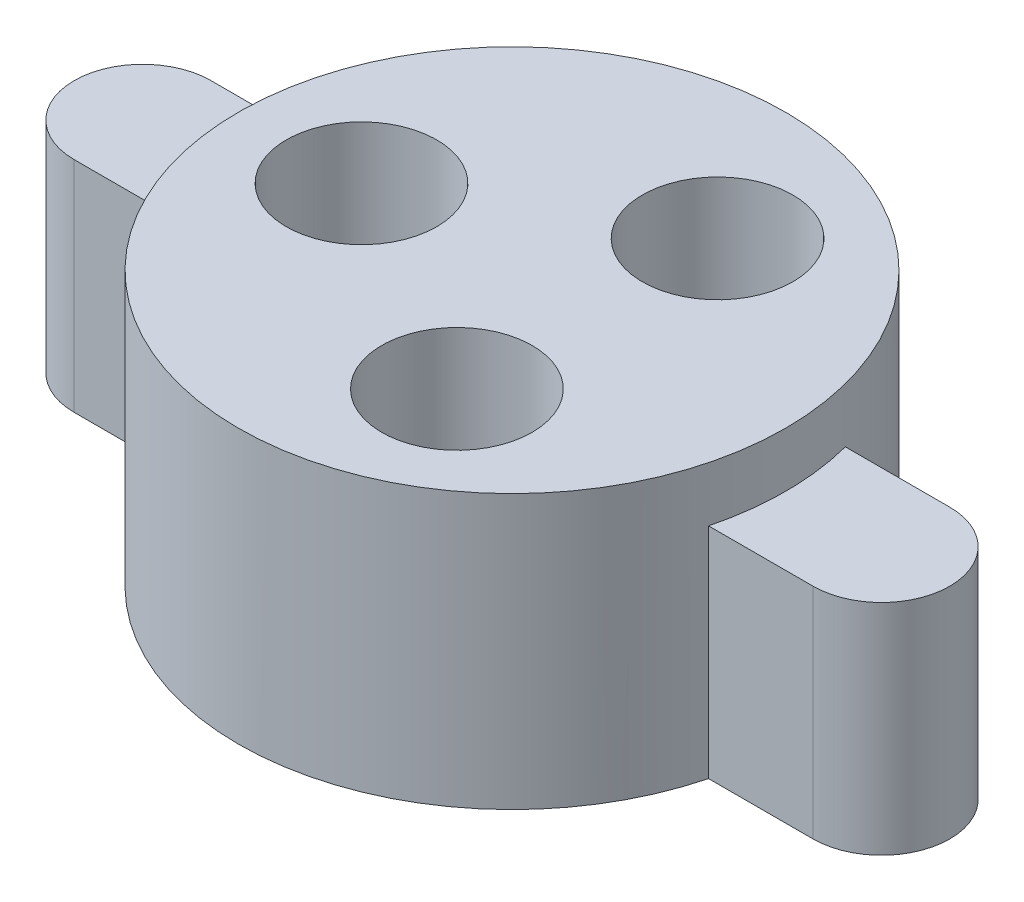
ISO-10303-21;
HEADER;
FILE_DESCRIPTION(('STEP AP214'),'2;1');
FILE_NAME('part.step','',(''),(''),'','','');
FILE_SCHEMA(('AUTOMOTIVE_DESIGN { 1 0 10303 214 1 1 1 1 }'));
ENDSEC;
DATA;
#1=APPLICATION_CONTEXT('core data for automotive mechanical design processes');
#2=APPLICATION_PROTOCOL_DEFINITION('international standard','automotive_design',2000,#1);
#3=PRODUCT_CONTEXT('',#1,'mechanical');
#4=PRODUCT('Part','Part','',(#3));
#5=PRODUCT_RELATED_PRODUCT_CATEGORY('part','',(#4));
#6=PRODUCT_DEFINITION_FORMATION('','',#4);
#7=PRODUCT_DEFINITION_CONTEXT('part definition',#1,'design');
#8=PRODUCT_DEFINITION('design','',#6,#7);
#9=PRODUCT_DEFINITION_SHAPE('','',#8);
#10=(LENGTH_UNIT() NAMED_UNIT(*) SI_UNIT(.MILLI.,.METRE.));
#11=(NAMED_UNIT(*) PLANE_ANGLE_UNIT() SI_UNIT($,.RADIAN.));
#12=(NAMED_UNIT(*) SI_UNIT($,.STERADIAN.) SOLID_ANGLE_UNIT());
#13=UNCERTAINTY_MEASURE_WITH_UNIT(LENGTH_MEASURE(1.E-05),#10,'distance_accuracy_value','');
#14=(GEOMETRIC_REPRESENTATION_CONTEXT(3) GLOBAL_UNCERTAINTY_ASSIGNED_CONTEXT((#13)) GLOBAL_UNIT_ASSIGNED_CONTEXT((#10,
#11,#12)) REPRESENTATION_CONTEXT('',''));
#15=CARTESIAN_POINT('',(0.,0.,0.));
#16=DIRECTION('',(0.,0.,1.));
#17=DIRECTION('',(1.,0.,0.));
#18=AXIS2_PLACEMENT_3D('',#15,#16,#17);
#19=CARTESIAN_POINT('',(-10.6542412771445,-55.6623242460077,207.513783632024));
#20=DIRECTION('',(0.,-1.,0.));
#21=DIRECTION('',(0.,0.,-1.));
#22=AXIS2_PLACEMENT_3D('',#19,#20,#21);
#23=PLANE('',#22);
#24=DIRECTION('',(1.,0.,0.));
#25=VECTOR('',#24,1.);
#26=CARTESIAN_POINT('',(-5.54721896024303,-55.6623242460077,217.513783632024));
#27=LINE('',#26,#25);
#28=CARTESIAN_POINT('',(-7.61476059472449,-55.6623242460077,217.513783632024));
#29=VERTEX_POINT('',#28);
#30=CARTESIAN_POINT('',(-3.79721896024304,-55.6623242460077,217.513783632024));
#31=VERTEX_POINT('',#30);
#32=EDGE_CURVE('E224',#29,#31,#27,.T.);
#33=ORIENTED_EDGE('',*,*,#32,.T.);
#34=CARTESIAN_POINT('',(-3.79721896024304,-55.6623242460077,215.013783632024));
#35=DIRECTION('',(0.,1.,0.));
#36=DIRECTION('',(1.,0.,0.));
#37=AXIS2_PLACEMENT_3D('',#34,#35,#36);
#38=CIRCLE('',#37,2.5);
#39=CARTESIAN_POINT('',(-3.79721896024304,-55.6623242460077,212.513783632024));
#40=VERTEX_POINT('',#39);
#41=EDGE_CURVE('E11',#31,#40,#38,.T.);
#42=ORIENTED_EDGE('',*,*,#41,.T.);
#43=DIRECTION('',(1.,0.,0.));
#44=VECTOR('',#43,1.);
#45=CARTESIAN_POINT('',(-5.54721896024303,-55.6623242460077,212.513783632024));
#46=LINE('',#45,#44);
#47=CARTESIAN_POINT('',(-7.61476059472449,-55.6623242460077,212.513783632024));
#48=VERTEX_POINT('',#47);
#49=EDGE_CURVE('E226',#48,#40,#46,.T.);
#50=ORIENTED_EDGE('',*,*,#49,.F.);
#51=CARTESIAN_POINT('',(-17.297218960243,-55.6623242460077,215.013783632024));
#52=DIRECTION('',(0.,-1.,0.));
#53=DIRECTION('',(1.,0.,0.));
#54=AXIS2_PLACEMENT_3D('',#51,#52,#53);
#55=CIRCLE('',#54,10.);
#56=EDGE_CURVE('E139',#48,#29,#55,.T.);
#57=ORIENTED_EDGE('',*,*,#56,.T.);
#58=EDGE_LOOP('',(#33,#42,#50,#57));
#59=FACE_BOUND('',#58,.T.);
#60=ADVANCED_FACE('F17',(#59),#23,.F.);
#61=CARTESIAN_POINT('',(-3.79721896024304,-55.6623242460077,215.013783632024));
#62=DIRECTION('',(0.,-1.,0.));
#63=DIRECTION('',(1.,0.,0.));
#64=AXIS2_PLACEMENT_3D('',#61,#62,#63);
#65=CYLINDRICAL_SURFACE('',#64,2.5);
#66=CARTESIAN_POINT('',(-3.79721896024304,-63.6623242460077,215.013783632024));
#67=DIRECTION('',(0.,1.,0.));
#68=DIRECTION('',(1.,0.,0.));
#69=AXIS2_PLACEMENT_3D('',#66,#67,#68);
#70=CIRCLE('',#69,2.5);
#71=CARTESIAN_POINT('',(-3.79721896024304,-63.6623242460077,217.513783632024));
#72=VERTEX_POINT('',#71);
#73=CARTESIAN_POINT('',(-3.79721896024304,-63.6623242460077,212.513783632024));
#74=VERTEX_POINT('',#73);
#75=EDGE_CURVE('E190',#72,#74,#70,.T.);
#76=ORIENTED_EDGE('',*,*,#75,.T.);
#77=DIRECTION('',(0.,-1.,0.));
#78=VECTOR('',#77,1.);
#79=CARTESIAN_POINT('',(-3.79721896024304,-55.6623242460077,212.513783632024));
#80=LINE('',#79,#78);
#81=EDGE_CURVE('E27',#40,#74,#80,.T.);
#82=ORIENTED_EDGE('',*,*,#81,.F.);
#83=ORIENTED_EDGE('',*,*,#41,.F.);
#84=DIRECTION('',(0.,-1.,0.));
#85=VECTOR('',#84,1.);
#86=CARTESIAN_POINT('',(-3.79721896024304,-55.6623242460077,217.513783632024));
#87=LINE('',#86,#85);
#88=EDGE_CURVE('E219',#31,#72,#87,.T.);
#89=ORIENTED_EDGE('',*,*,#88,.T.);
#90=EDGE_LOOP('',(#76,#82,#83,#89));
#91=FACE_BOUND('',#90,.T.);
#92=ADVANCED_FACE('F19',(#91),#65,.T.);
#93=CARTESIAN_POINT('',(-5.54721896024303,-55.6623242460077,212.513783632024));
#94=DIRECTION('',(0.,0.,-1.));
#95=DIRECTION('',(0.,-1.,0.));
#96=AXIS2_PLACEMENT_3D('',#93,#94,#95);
#97=PLANE('',#96);
#98=DIRECTION('',(1.,0.,0.));
#99=VECTOR('',#98,1.);
#100=CARTESIAN_POINT('',(-5.54721896024303,-63.6623242460077,212.513783632024));
#101=LINE('',#100,#99);
#102=CARTESIAN_POINT('',(-7.61476059472449,-63.6623242460077,212.513783632024));
#103=VERTEX_POINT('',#102);
#104=EDGE_CURVE('E183',#103,#74,#101,.T.);
#105=ORIENTED_EDGE('',*,*,#104,.F.);
#106=DIRECTION('',(0.,-1.,0.));
#107=VECTOR('',#106,1.);
#108=CARTESIAN_POINT('',(-7.61476059472449,-55.6623242460077,212.513783632024));
#109=LINE('',#108,#107);
#110=EDGE_CURVE('E141',#48,#103,#109,.T.);
#111=ORIENTED_EDGE('',*,*,#110,.F.);
#112=ORIENTED_EDGE('',*,*,#49,.T.);
#113=ORIENTED_EDGE('',*,*,#81,.T.);
#114=EDGE_LOOP('',(#105,#111,#112,#113));
#115=FACE_BOUND('',#114,.T.);
#116=ADVANCED_FACE('F234',(#115),#97,.T.);
#117=CARTESIAN_POINT('',(-5.54721896024303,-55.6623242460077,217.513783632024));
#118=DIRECTION('',(0.,0.,-1.));
#119=DIRECTION('',(0.,-1.,0.));
#120=AXIS2_PLACEMENT_3D('',#117,#118,#119);
#121=PLANE('',#120);
#122=DIRECTION('',(1.,0.,0.));
#123=VECTOR('',#122,1.);
#124=CARTESIAN_POINT('',(-5.54721896024303,-63.6623242460077,217.513783632024));
#125=LINE('',#124,#123);
#126=CARTESIAN_POINT('',(-7.61476059472449,-63.6623242460077,217.513783632024));
#127=VERTEX_POINT('',#126);
#128=EDGE_CURVE('E192',#127,#72,#125,.T.);
#129=ORIENTED_EDGE('',*,*,#128,.T.);
#130=ORIENTED_EDGE('',*,*,#88,.F.);
#131=ORIENTED_EDGE('',*,*,#32,.F.);
#132=DIRECTION('',(0.,-1.,0.));
#133=VECTOR('',#132,1.);
#134=CARTESIAN_POINT('',(-7.61476059472449,-55.6623242460077,217.513783632024));
#135=LINE('',#134,#133);
#136=EDGE_CURVE('E131',#29,#127,#135,.T.);
#137=ORIENTED_EDGE('',*,*,#136,.T.);
#138=EDGE_LOOP('',(#129,#130,#131,#137));
#139=FACE_BOUND('',#138,.T.);
#140=ADVANCED_FACE('F397',(#139),#121,.F.);
#141=CARTESIAN_POINT('',(-10.6542412771445,-55.6623242460077,207.513783632024));
#142=DIRECTION('',(0.,-1.,0.));
#143=DIRECTION('',(0.,0.,-1.));
#144=AXIS2_PLACEMENT_3D('',#141,#142,#143);
#145=PLANE('',#144);
#146=DIRECTION('',(1.,0.,0.));
#147=VECTOR('',#146,1.);
#148=CARTESIAN_POINT('',(-29.0472189602431,-55.6623242460077,212.513783632024));
#149=LINE('',#148,#147);
#150=CARTESIAN_POINT('',(-30.797218960243,-55.6623242460077,212.513783632024));
#151=VERTEX_POINT('',#150);
#152=CARTESIAN_POINT('',(-26.9796773257616,-55.6623242460077,212.513783632024));
#153=VERTEX_POINT('',#152);
#154=EDGE_CURVE('E208',#151,#153,#149,.T.);
#155=ORIENTED_EDGE('',*,*,#154,.F.);
#156=CARTESIAN_POINT('',(-30.797218960243,-55.6623242460077,215.013783632024));
#157=DIRECTION('',(0.,-1.,0.));
#158=DIRECTION('',(1.,0.,0.));
#159=AXIS2_PLACEMENT_3D('',#156,#157,#158);
#160=CIRCLE('',#159,2.5);
#161=CARTESIAN_POINT('',(-30.797218960243,-55.6623242460077,217.513783632024));
#162=VERTEX_POINT('',#161);
#163=EDGE_CURVE('E220',#162,#151,#160,.T.);
#164=ORIENTED_EDGE('',*,*,#163,.F.);
#165=DIRECTION('',(1.,0.,0.));
#166=VECTOR('',#165,1.);
#167=CARTESIAN_POINT('',(-28.8884481430023,-55.6623242460077,217.513783632024));
#168=LINE('',#167,#166);
#169=CARTESIAN_POINT('',(-26.9796773257616,-55.6623242460077,217.513783632024));
#170=VERTEX_POINT('',#169);
#171=EDGE_CURVE('E211',#162,#170,#168,.T.);
#172=ORIENTED_EDGE('',*,*,#171,.T.);
#173=CARTESIAN_POINT('',(-17.297218960243,-55.6623242460077,215.013783632024));
#174=DIRECTION('',(0.,-1.,0.));
#175=DIRECTION('',(1.,0.,0.));
#176=AXIS2_PLACEMENT_3D('',#173,#174,#175);
#177=CIRCLE('',#176,10.);
#178=EDGE_CURVE('E159',#170,#153,#177,.T.);
#179=ORIENTED_EDGE('',*,*,#178,.T.);
#180=EDGE_LOOP('',(#155,#164,#172,#179));
#181=FACE_BOUND('',#180,.T.);
#182=ADVANCED_FACE('F425',(#181),#145,.F.);
#183=CARTESIAN_POINT('',(-30.797218960243,-55.6623242460077,215.013783632024));
#184=DIRECTION('',(0.,-1.,0.));
#185=DIRECTION('',(1.,0.,0.));
#186=AXIS2_PLACEMENT_3D('',#183,#184,#185);
#187=CYLINDRICAL_SURFACE('',#186,2.5);
#188=CARTESIAN_POINT('',(-30.797218960243,-63.6623242460077,215.013783632024));
#189=DIRECTION('',(0.,-1.,0.));
#190=DIRECTION('',(1.,0.,0.));
#191=AXIS2_PLACEMENT_3D('',#188,#189,#190);
#192=CIRCLE('',#191,2.5);
#193=CARTESIAN_POINT('',(-30.797218960243,-63.6623242460077,217.513783632024));
#194=VERTEX_POINT('',#193);
#195=CARTESIAN_POINT('',(-30.797218960243,-63.6623242460077,212.513783632024));
#196=VERTEX_POINT('',#195);
#197=EDGE_CURVE('E196',#194,#196,#192,.T.);
#198=ORIENTED_EDGE('',*,*,#197,.F.);
#199=DIRECTION('',(0.,-1.,0.));
#200=VECTOR('',#199,1.);
#201=CARTESIAN_POINT('',(-30.797218960243,-55.6623242460077,217.513783632024));
#202=LINE('',#201,#200);
#203=EDGE_CURVE('E212',#162,#194,#202,.T.);
#204=ORIENTED_EDGE('',*,*,#203,.F.);
#205=ORIENTED_EDGE('',*,*,#163,.T.);
#206=DIRECTION('',(0.,-1.,0.));
#207=VECTOR('',#206,1.);
#208=CARTESIAN_POINT('',(-30.797218960243,-55.6623242460077,212.513783632024));
#209=LINE('',#208,#207);
#210=EDGE_CURVE('E202',#151,#196,#209,.T.);
#211=ORIENTED_EDGE('',*,*,#210,.T.);
#212=EDGE_LOOP('',(#198,#204,#205,#211));
#213=FACE_BOUND('',#212,.T.);
#214=ADVANCED_FACE('F430',(#213),#187,.T.);
#215=CARTESIAN_POINT('',(-28.8884481430023,-55.6623242460077,217.513783632024));
#216=DIRECTION('',(0.,0.,-1.));
#217=DIRECTION('',(0.,-1.,0.));
#218=AXIS2_PLACEMENT_3D('',#215,#216,#217);
#219=PLANE('',#218);
#220=DIRECTION('',(1.,0.,0.));
#221=VECTOR('',#220,1.);
#222=CARTESIAN_POINT('',(-28.8884481430023,-63.6623242460077,217.513783632024));
#223=LINE('',#222,#221);
#224=CARTESIAN_POINT('',(-26.9796773257616,-63.6623242460077,217.513783632024));
#225=VERTEX_POINT('',#224);
#226=EDGE_CURVE('E193',#194,#225,#223,.T.);
#227=ORIENTED_EDGE('',*,*,#226,.T.);
#228=DIRECTION('',(0.,-1.,0.));
#229=VECTOR('',#228,1.);
#230=CARTESIAN_POINT('',(-26.9796773257616,-55.6623242460077,217.513783632024));
#231=LINE('',#230,#229);
#232=EDGE_CURVE('E170',#170,#225,#231,.T.);
#233=ORIENTED_EDGE('',*,*,#232,.F.);
#234=ORIENTED_EDGE('',*,*,#171,.F.);
#235=ORIENTED_EDGE('',*,*,#203,.T.);
#236=EDGE_LOOP('',(#227,#233,#234,#235));
#237=FACE_BOUND('',#236,.T.);
#238=ADVANCED_FACE('F363',(#237),#219,.F.);
#239=CARTESIAN_POINT('',(-29.0472189602431,-55.6623242460077,212.513783632024));
#240=DIRECTION('',(0.,0.,-1.));
#241=DIRECTION('',(0.,-1.,0.));
#242=AXIS2_PLACEMENT_3D('',#239,#240,#241);
#243=PLANE('',#242);
#244=DIRECTION('',(1.,0.,0.));
#245=VECTOR('',#244,1.);
#246=CARTESIAN_POINT('',(-29.0472189602431,-63.6623242460077,212.513783632024));
#247=LINE('',#246,#245);
#248=CARTESIAN_POINT('',(-26.9796773257616,-63.6623242460077,212.513783632024));
#249=VERTEX_POINT('',#248);
#250=EDGE_CURVE('E205',#196,#249,#247,.T.);
#251=ORIENTED_EDGE('',*,*,#250,.F.);
#252=ORIENTED_EDGE('',*,*,#210,.F.);
#253=ORIENTED_EDGE('',*,*,#154,.T.);
#254=DIRECTION('',(0.,-1.,0.));
#255=VECTOR('',#254,1.);
#256=CARTESIAN_POINT('',(-26.9796773257616,-55.6623242460077,212.513783632024));
#257=LINE('',#256,#255);
#258=EDGE_CURVE('E156',#153,#249,#257,.T.);
#259=ORIENTED_EDGE('',*,*,#258,.T.);
#260=EDGE_LOOP('',(#251,#252,#253,#259));
#261=FACE_BOUND('',#260,.T.);
#262=ADVANCED_FACE('F354',(#261),#243,.T.);
#263=CARTESIAN_POINT('',(-17.297218960243,-53.6623242460077,215.013783632024));
#264=DIRECTION('',(0.,-1.,0.));
#265=DIRECTION('',(0.,0.,-1.));
#266=AXIS2_PLACEMENT_3D('',#263,#264,#265);
#267=PLANE('',#266);
#268=CARTESIAN_POINT('',(-17.297218960243,-53.6623242460077,215.013783632024));
#269=DIRECTION('',(0.,-1.,0.));
#270=DIRECTION('',(1.,0.,0.));
#271=AXIS2_PLACEMENT_3D('',#268,#269,#270);
#272=CIRCLE('',#271,10.);
#273=CARTESIAN_POINT('',(-7.29721896024305,-53.6623242460077,215.013783632024));
#274=VERTEX_POINT('',#273);
#275=EDGE_CURVE('E126',#274,#274,#272,.T.);
#276=ORIENTED_EDGE('',*,*,#275,.F.);
#277=EDGE_LOOP('',(#276));
#278=FACE_BOUND('',#277,.T.);
#279=CARTESIAN_POINT('',(-22.797218960243,-53.6623242460077,215.013783632024));
#280=DIRECTION('',(0.,-1.,0.));
#281=DIRECTION('',(1.,0.,0.));
#282=AXIS2_PLACEMENT_3D('',#279,#280,#281);
#283=CIRCLE('',#282,2.75);
#284=CARTESIAN_POINT('',(-20.0472189602431,-53.6623242460077,215.013783632024));
#285=VERTEX_POINT('',#284);
#286=EDGE_CURVE('E172',#285,#285,#283,.T.);
#287=ORIENTED_EDGE('',*,*,#286,.T.);
#288=EDGE_LOOP('',(#287));
#289=FACE_BOUND('',#288,.T.);
#290=CARTESIAN_POINT('',(-14.547218960243,-53.6623242460077,210.25064391121));
#291=DIRECTION('',(0.,-1.,0.));
#292=DIRECTION('',(1.,0.,0.));
#293=AXIS2_PLACEMENT_3D('',#290,#291,#292);
#294=CIRCLE('',#293,2.75);
#295=CARTESIAN_POINT('',(-11.797218960243,-53.6623242460077,210.25064391121));
#296=VERTEX_POINT('',#295);
#297=EDGE_CURVE('E155',#296,#296,#294,.T.);
#298=ORIENTED_EDGE('',*,*,#297,.T.);
#299=EDGE_LOOP('',(#298));
#300=FACE_BOUND('',#299,.T.);
#301=CARTESIAN_POINT('',(-14.547218960243,-53.6623242460077,219.776923352839));
#302=DIRECTION('',(0.,-1.,0.));
#303=DIRECTION('',(1.,0.,0.));
#304=AXIS2_PLACEMENT_3D('',#301,#302,#303);
#305=CIRCLE('',#304,2.75);
#306=CARTESIAN_POINT('',(-11.797218960243,-53.6623242460077,219.776923352839));
#307=VERTEX_POINT('',#306);
#308=EDGE_CURVE('E151',#307,#307,#305,.T.);
#309=ORIENTED_EDGE('',*,*,#308,.T.);
#310=EDGE_LOOP('',(#309));
#311=FACE_BOUND('',#310,.T.);
#312=ADVANCED_FACE('F358',(#278,#289,#300,#311),#267,.F.);
#313=CARTESIAN_POINT('',(-17.297218960243,-63.6623242460077,215.013783632024));
#314=DIRECTION('',(0.,-1.,0.));
#315=DIRECTION('',(0.,0.,-1.));
#316=AXIS2_PLACEMENT_3D('',#313,#314,#315);
#317=PLANE('',#316);
#318=CARTESIAN_POINT('',(-17.297218960243,-63.6623242460077,215.013783632024));
#319=DIRECTION('',(0.,-1.,0.));
#320=DIRECTION('',(1.,0.,0.));
#321=AXIS2_PLACEMENT_3D('',#318,#319,#320);
#322=CIRCLE('',#321,10.);
#323=EDGE_CURVE('E150',#249,#103,#322,.T.);
#324=ORIENTED_EDGE('',*,*,#323,.T.);
#325=ORIENTED_EDGE('',*,*,#104,.T.);
#326=ORIENTED_EDGE('',*,*,#75,.F.);
#327=ORIENTED_EDGE('',*,*,#128,.F.);
#328=CARTESIAN_POINT('',(-17.297218960243,-63.6623242460077,215.013783632024));
#329=DIRECTION('',(0.,-1.,0.));
#330=DIRECTION('',(1.,0.,0.));
#331=AXIS2_PLACEMENT_3D('',#328,#329,#330);
#332=CIRCLE('',#331,10.);
#333=EDGE_CURVE('E171',#127,#225,#332,.T.);
#334=ORIENTED_EDGE('',*,*,#333,.T.);
#335=ORIENTED_EDGE('',*,*,#226,.F.);
#336=ORIENTED_EDGE('',*,*,#197,.T.);
#337=ORIENTED_EDGE('',*,*,#250,.T.);
#338=EDGE_LOOP('',(#324,#325,#326,#327,#334,#335,#336,#337));
#339=FACE_BOUND('',#338,.T.);
#340=CARTESIAN_POINT('',(-22.797218960243,-63.6623242460077,215.013783632024));
#341=DIRECTION('',(0.,-1.,0.));
#342=DIRECTION('',(1.,0.,0.));
#343=AXIS2_PLACEMENT_3D('',#340,#341,#342);
#344=CIRCLE('',#343,2.75);
#345=CARTESIAN_POINT('',(-20.0472189602431,-63.6623242460077,215.013783632024));
#346=VERTEX_POINT('',#345);
#347=EDGE_CURVE('E175',#346,#346,#344,.T.);
#348=ORIENTED_EDGE('',*,*,#347,.F.);
#349=EDGE_LOOP('',(#348));
#350=FACE_BOUND('',#349,.T.);
#351=CARTESIAN_POINT('',(-14.547218960243,-63.6623242460077,210.25064391121));
#352=DIRECTION('',(0.,-1.,0.));
#353=DIRECTION('',(1.,0.,0.));
#354=AXIS2_PLACEMENT_3D('',#351,#352,#353);
#355=CIRCLE('',#354,2.75);
#356=CARTESIAN_POINT('',(-11.797218960243,-63.6623242460077,210.25064391121));
#357=VERTEX_POINT('',#356);
#358=EDGE_CURVE('E154',#357,#357,#355,.T.);
#359=ORIENTED_EDGE('',*,*,#358,.F.);
#360=EDGE_LOOP('',(#359));
#361=FACE_BOUND('',#360,.T.);
#362=CARTESIAN_POINT('',(-14.547218960243,-63.6623242460077,219.776923352839));
#363=DIRECTION('',(0.,-1.,0.));
#364=DIRECTION('',(1.,0.,0.));
#365=AXIS2_PLACEMENT_3D('',#362,#363,#364);
#366=CIRCLE('',#365,2.75);
#367=CARTESIAN_POINT('',(-11.797218960243,-63.6623242460077,219.776923352839));
#368=VERTEX_POINT('',#367);
#369=EDGE_CURVE('E146',#368,#368,#366,.T.);
#370=ORIENTED_EDGE('',*,*,#369,.F.);
#371=EDGE_LOOP('',(#370));
#372=FACE_BOUND('',#371,.T.);
#373=ADVANCED_FACE('F238',(#339,#350,#361,#372),#317,.T.);
#374=CARTESIAN_POINT('',(-14.547218960243,-63.6623242460077,219.776923352839));
#375=DIRECTION('',(0.,1.,0.));
#376=DIRECTION('',(-1.,0.,0.));
#377=AXIS2_PLACEMENT_3D('',#374,#375,#376);
#378=CYLINDRICAL_SURFACE('',#377,2.75);
#379=ORIENTED_EDGE('',*,*,#308,.F.);
#380=EDGE_LOOP('',(#379));
#381=FACE_BOUND('',#380,.T.);
#382=ORIENTED_EDGE('',*,*,#369,.T.);
#383=EDGE_LOOP('',(#382));
#384=FACE_BOUND('',#383,.T.);
#385=ADVANCED_FACE('F374',(#381,#384),#378,.F.);
#386=CARTESIAN_POINT('',(-14.547218960243,-63.6623242460077,210.25064391121));
#387=DIRECTION('',(0.,1.,0.));
#388=DIRECTION('',(-1.,0.,0.));
#389=AXIS2_PLACEMENT_3D('',#386,#387,#388);
#390=CYLINDRICAL_SURFACE('',#389,2.75);
#391=ORIENTED_EDGE('',*,*,#297,.F.);
#392=EDGE_LOOP('',(#391));
#393=FACE_BOUND('',#392,.T.);
#394=ORIENTED_EDGE('',*,*,#358,.T.);
#395=EDGE_LOOP('',(#394));
#396=FACE_BOUND('',#395,.T.);
#397=ADVANCED_FACE('F367',(#393,#396),#390,.F.);
#398=CARTESIAN_POINT('',(-22.797218960243,-63.6623242460077,215.013783632024));
#399=DIRECTION('',(0.,1.,0.));
#400=DIRECTION('',(-1.,0.,0.));
#401=AXIS2_PLACEMENT_3D('',#398,#399,#400);
#402=CYLINDRICAL_SURFACE('',#401,2.75);
#403=ORIENTED_EDGE('',*,*,#286,.F.);
#404=EDGE_LOOP('',(#403));
#405=FACE_BOUND('',#404,.T.);
#406=ORIENTED_EDGE('',*,*,#347,.T.);
#407=EDGE_LOOP('',(#406));
#408=FACE_BOUND('',#407,.T.);
#409=ADVANCED_FACE('F346',(#405,#408),#402,.F.);
#410=CARTESIAN_POINT('',(-17.297218960243,-63.6623242460077,215.013783632024));
#411=DIRECTION('',(0.,1.,0.));
#412=DIRECTION('',(-1.,0.,0.));
#413=AXIS2_PLACEMENT_3D('',#410,#411,#412);
#414=CYLINDRICAL_SURFACE('',#413,10.);
#415=ORIENTED_EDGE('',*,*,#136,.F.);
#416=ORIENTED_EDGE('',*,*,#56,.F.);
#417=ORIENTED_EDGE('',*,*,#110,.T.);
#418=ORIENTED_EDGE('',*,*,#323,.F.);
#419=ORIENTED_EDGE('',*,*,#258,.F.);
#420=ORIENTED_EDGE('',*,*,#178,.F.);
#421=ORIENTED_EDGE('',*,*,#232,.T.);
#422=ORIENTED_EDGE('',*,*,#333,.F.);
#423=EDGE_LOOP('',(#415,#416,#417,#418,#419,#420,#421,#422));
#424=FACE_BOUND('',#423,.T.);
#425=ORIENTED_EDGE('',*,*,#275,.T.);
#426=EDGE_LOOP('',(#425));
#427=FACE_BOUND('',#426,.T.);
#428=ADVANCED_FACE('F128',(#424,#427),#414,.T.);
#429=CLOSED_SHELL('',(#60,#92,#116,#140,#182,#214,#238,#262,#312,#373,#385,#397,#409,#428));
#430=MANIFOLD_SOLID_BREP('B1',#429);
#431=ADVANCED_BREP_SHAPE_REPRESENTATION('',(#18,#430),#14);
#432=SHAPE_DEFINITION_REPRESENTATION(#9,#431);
ENDSEC;
END-ISO-10303-21;
